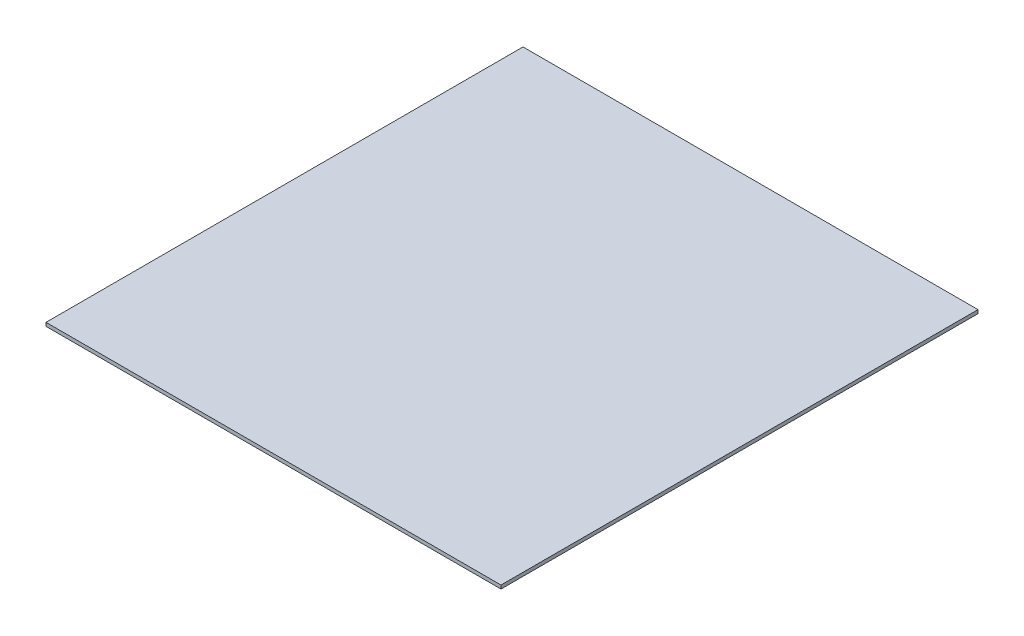
ISO-10303-21;
HEADER;
FILE_DESCRIPTION(('STEP AP214'),'2;1');
FILE_NAME('part.step','',(''),(''),'','','');
FILE_SCHEMA(('AUTOMOTIVE_DESIGN { 1 0 10303 214 1 1 1 1 }'));
ENDSEC;
DATA;
#1=APPLICATION_CONTEXT('core data for automotive mechanical design processes');
#2=APPLICATION_PROTOCOL_DEFINITION('international standard','automotive_design',2000,#1);
#3=PRODUCT_CONTEXT('',#1,'mechanical');
#4=PRODUCT('Part','Part','',(#3));
#5=PRODUCT_RELATED_PRODUCT_CATEGORY('part','',(#4));
#6=PRODUCT_DEFINITION_FORMATION('','',#4);
#7=PRODUCT_DEFINITION_CONTEXT('part definition',#1,'design');
#8=PRODUCT_DEFINITION('design','',#6,#7);
#9=PRODUCT_DEFINITION_SHAPE('','',#8);
#10=(LENGTH_UNIT() NAMED_UNIT(*) SI_UNIT(.MILLI.,.METRE.));
#11=(NAMED_UNIT(*) PLANE_ANGLE_UNIT() SI_UNIT($,.RADIAN.));
#12=(NAMED_UNIT(*) SI_UNIT($,.STERADIAN.) SOLID_ANGLE_UNIT());
#13=UNCERTAINTY_MEASURE_WITH_UNIT(LENGTH_MEASURE(1.E-05),#10,'distance_accuracy_value','');
#14=(GEOMETRIC_REPRESENTATION_CONTEXT(3) GLOBAL_UNCERTAINTY_ASSIGNED_CONTEXT((#13)) GLOBAL_UNIT_ASSIGNED_CONTEXT((#10,
#11,#12)) REPRESENTATION_CONTEXT('',''));
#15=CARTESIAN_POINT('',(0.,0.,0.));
#16=DIRECTION('',(0.,0.,1.));
#17=DIRECTION('',(1.,0.,0.));
#18=AXIS2_PLACEMENT_3D('',#15,#16,#17);
#19=CARTESIAN_POINT('',(98.425,1.524,-103.1875));
#20=DIRECTION('',(-1.,0.,0.));
#21=DIRECTION('',(0.,0.,1.));
#22=AXIS2_PLACEMENT_3D('',#19,#20,#21);
#23=PLANE('',#22);
#24=DIRECTION('',(0.,0.,-1.));
#25=VECTOR('',#24,1.);
#26=CARTESIAN_POINT('',(98.425,0.,-103.1875));
#27=LINE('',#26,#25);
#28=CARTESIAN_POINT('',(98.425,0.,103.1875));
#29=VERTEX_POINT('',#28);
#30=CARTESIAN_POINT('',(98.425,0.,-103.1875));
#31=VERTEX_POINT('',#30);
#32=EDGE_CURVE('E107',#29,#31,#27,.T.);
#33=ORIENTED_EDGE('',*,*,#32,.T.);
#34=DIRECTION('',(0.,-1.,0.));
#35=VECTOR('',#34,1.);
#36=CARTESIAN_POINT('',(98.425,1.524,-103.1875));
#37=LINE('',#36,#35);
#38=CARTESIAN_POINT('',(98.425,1.524,-103.1875));
#39=VERTEX_POINT('',#38);
#40=EDGE_CURVE('E11',#39,#31,#37,.T.);
#41=ORIENTED_EDGE('',*,*,#40,.F.);
#42=DIRECTION('',(0.,0.,-1.));
#43=VECTOR('',#42,1.);
#44=CARTESIAN_POINT('',(98.425,1.524,-103.1875));
#45=LINE('',#44,#43);
#46=CARTESIAN_POINT('',(98.425,1.524,103.1875));
#47=VERTEX_POINT('',#46);
#48=EDGE_CURVE('E91',#47,#39,#45,.T.);
#49=ORIENTED_EDGE('',*,*,#48,.F.);
#50=DIRECTION('',(0.,-1.,0.));
#51=VECTOR('',#50,1.);
#52=CARTESIAN_POINT('',(98.425,1.524,103.1875));
#53=LINE('',#52,#51);
#54=EDGE_CURVE('E103',#47,#29,#53,.T.);
#55=ORIENTED_EDGE('',*,*,#54,.T.);
#56=EDGE_LOOP('',(#33,#41,#49,#55));
#57=FACE_BOUND('',#56,.T.);
#58=ADVANCED_FACE('F39',(#57),#23,.F.);
#59=CARTESIAN_POINT('',(-98.425,1.524,-103.1875));
#60=DIRECTION('',(0.,0.,1.));
#61=DIRECTION('',(1.,0.,0.));
#62=AXIS2_PLACEMENT_3D('',#59,#60,#61);
#63=PLANE('',#62);
#64=DIRECTION('',(-1.,0.,0.));
#65=VECTOR('',#64,1.);
#66=CARTESIAN_POINT('',(-98.425,0.,-103.1875));
#67=LINE('',#66,#65);
#68=CARTESIAN_POINT('',(-98.425,0.,-103.1875));
#69=VERTEX_POINT('',#68);
#70=EDGE_CURVE('E96',#31,#69,#67,.T.);
#71=ORIENTED_EDGE('',*,*,#70,.T.);
#72=DIRECTION('',(0.,-1.,0.));
#73=VECTOR('',#72,1.);
#74=CARTESIAN_POINT('',(-98.425,1.524,-103.1875));
#75=LINE('',#74,#73);
#76=CARTESIAN_POINT('',(-98.425,1.524,-103.1875));
#77=VERTEX_POINT('',#76);
#78=EDGE_CURVE('E48',#77,#69,#75,.T.);
#79=ORIENTED_EDGE('',*,*,#78,.F.);
#80=DIRECTION('',(-1.,0.,0.));
#81=VECTOR('',#80,1.);
#82=CARTESIAN_POINT('',(-98.425,1.524,-103.1875));
#83=LINE('',#82,#81);
#84=EDGE_CURVE('E86',#39,#77,#83,.T.);
#85=ORIENTED_EDGE('',*,*,#84,.F.);
#86=ORIENTED_EDGE('',*,*,#40,.T.);
#87=EDGE_LOOP('',(#71,#79,#85,#86));
#88=FACE_BOUND('',#87,.T.);
#89=ADVANCED_FACE('F95',(#88),#63,.F.);
#90=CARTESIAN_POINT('',(-98.425,1.524,-103.1875));
#91=DIRECTION('',(1.,0.,0.));
#92=DIRECTION('',(0.,0.,-1.));
#93=AXIS2_PLACEMENT_3D('',#90,#91,#92);
#94=PLANE('',#93);
#95=DIRECTION('',(0.,0.,1.));
#96=VECTOR('',#95,1.);
#97=CARTESIAN_POINT('',(-98.425,0.,-103.1875));
#98=LINE('',#97,#96);
#99=CARTESIAN_POINT('',(-98.425,0.,103.1875));
#100=VERTEX_POINT('',#99);
#101=EDGE_CURVE('E73',#69,#100,#98,.T.);
#102=ORIENTED_EDGE('',*,*,#101,.T.);
#103=DIRECTION('',(0.,-1.,0.));
#104=VECTOR('',#103,1.);
#105=CARTESIAN_POINT('',(-98.425,1.524,103.1875));
#106=LINE('',#105,#104);
#107=CARTESIAN_POINT('',(-98.425,1.524,103.1875));
#108=VERTEX_POINT('',#107);
#109=EDGE_CURVE('E98',#108,#100,#106,.T.);
#110=ORIENTED_EDGE('',*,*,#109,.F.);
#111=DIRECTION('',(0.,0.,1.));
#112=VECTOR('',#111,1.);
#113=CARTESIAN_POINT('',(-98.425,1.524,-103.1875));
#114=LINE('',#113,#112);
#115=EDGE_CURVE('E89',#77,#108,#114,.T.);
#116=ORIENTED_EDGE('',*,*,#115,.F.);
#117=ORIENTED_EDGE('',*,*,#78,.T.);
#118=EDGE_LOOP('',(#102,#110,#116,#117));
#119=FACE_BOUND('',#118,.T.);
#120=ADVANCED_FACE('F99',(#119),#94,.F.);
#121=CARTESIAN_POINT('',(-98.425,1.524,103.1875));
#122=DIRECTION('',(0.,0.,-1.));
#123=DIRECTION('',(-1.,0.,0.));
#124=AXIS2_PLACEMENT_3D('',#121,#122,#123);
#125=PLANE('',#124);
#126=DIRECTION('',(1.,0.,0.));
#127=VECTOR('',#126,1.);
#128=CARTESIAN_POINT('',(-98.425,0.,103.1875));
#129=LINE('',#128,#127);
#130=EDGE_CURVE('E79',#100,#29,#129,.T.);
#131=ORIENTED_EDGE('',*,*,#130,.T.);
#132=ORIENTED_EDGE('',*,*,#54,.F.);
#133=DIRECTION('',(1.,0.,0.));
#134=VECTOR('',#133,1.);
#135=CARTESIAN_POINT('',(-98.425,1.524,103.1875));
#136=LINE('',#135,#134);
#137=EDGE_CURVE('E56',#108,#47,#136,.T.);
#138=ORIENTED_EDGE('',*,*,#137,.F.);
#139=ORIENTED_EDGE('',*,*,#109,.T.);
#140=EDGE_LOOP('',(#131,#132,#138,#139));
#141=FACE_BOUND('',#140,.T.);
#142=ADVANCED_FACE('F120',(#141),#125,.F.);
#143=CARTESIAN_POINT('',(0.,1.524,0.));
#144=DIRECTION('',(0.,1.,0.));
#145=DIRECTION('',(0.,0.,1.));
#146=AXIS2_PLACEMENT_3D('',#143,#144,#145);
#147=PLANE('',#146);
#148=ORIENTED_EDGE('',*,*,#48,.T.);
#149=ORIENTED_EDGE('',*,*,#84,.T.);
#150=ORIENTED_EDGE('',*,*,#115,.T.);
#151=ORIENTED_EDGE('',*,*,#137,.T.);
#152=EDGE_LOOP('',(#148,#149,#150,#151));
#153=FACE_BOUND('',#152,.T.);
#154=ADVANCED_FACE('F87',(#153),#147,.T.);
#155=CARTESIAN_POINT('',(0.,0.,0.));
#156=DIRECTION('',(0.,1.,0.));
#157=DIRECTION('',(0.,0.,1.));
#158=AXIS2_PLACEMENT_3D('',#155,#156,#157);
#159=PLANE('',#158);
#160=ORIENTED_EDGE('',*,*,#32,.F.);
#161=ORIENTED_EDGE('',*,*,#130,.F.);
#162=ORIENTED_EDGE('',*,*,#101,.F.);
#163=ORIENTED_EDGE('',*,*,#70,.F.);
#164=EDGE_LOOP('',(#160,#161,#162,#163));
#165=FACE_BOUND('',#164,.T.);
#166=ADVANCED_FACE('F123',(#165),#159,.F.);
#167=CLOSED_SHELL('',(#58,#89,#120,#142,#154,#166));
#168=MANIFOLD_SOLID_BREP('B2',#167);
#169=ADVANCED_BREP_SHAPE_REPRESENTATION('',(#18,#168),#14);
#170=SHAPE_DEFINITION_REPRESENTATION(#9,#169);
ENDSEC;
END-ISO-10303-21;
